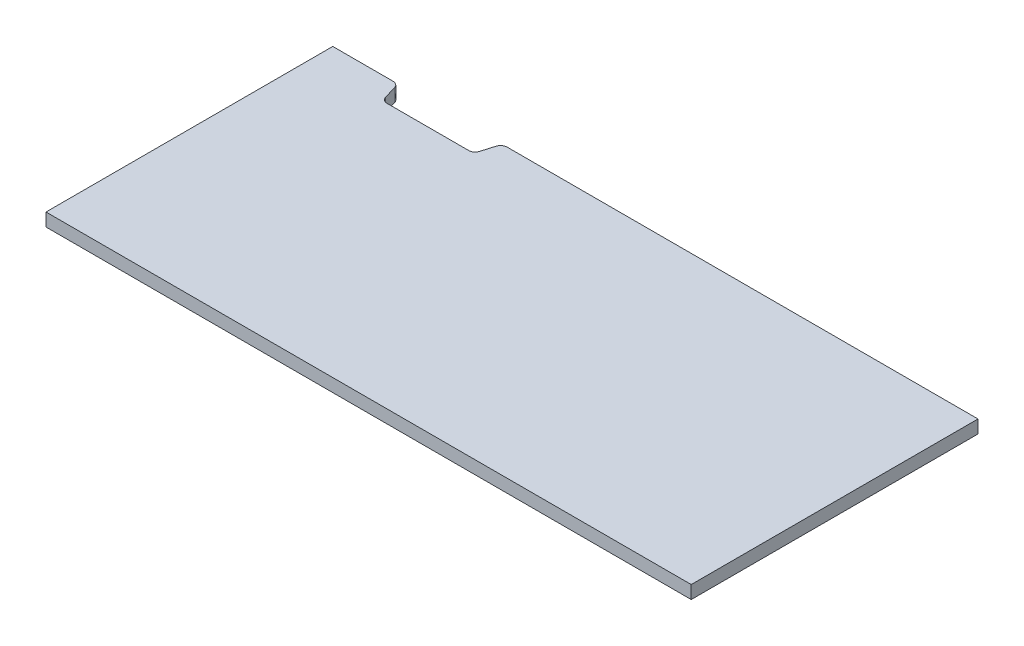
ISO-10303-21;
HEADER;
FILE_DESCRIPTION(('STEP AP214'),'2;1');
FILE_NAME('part.step','',(''),(''),'','','');
FILE_SCHEMA(('AUTOMOTIVE_DESIGN { 1 0 10303 214 1 1 1 1 }'));
ENDSEC;
DATA;
#1=APPLICATION_CONTEXT('core data for automotive mechanical design processes');
#2=APPLICATION_PROTOCOL_DEFINITION('international standard','automotive_design',2000,#1);
#3=PRODUCT_CONTEXT('',#1,'mechanical');
#4=PRODUCT('Part','Part','',(#3));
#5=PRODUCT_RELATED_PRODUCT_CATEGORY('part','',(#4));
#6=PRODUCT_DEFINITION_FORMATION('','',#4);
#7=PRODUCT_DEFINITION_CONTEXT('part definition',#1,'design');
#8=PRODUCT_DEFINITION('design','',#6,#7);
#9=PRODUCT_DEFINITION_SHAPE('','',#8);
#10=(LENGTH_UNIT() NAMED_UNIT(*) SI_UNIT(.MILLI.,.METRE.));
#11=(NAMED_UNIT(*) PLANE_ANGLE_UNIT() SI_UNIT($,.RADIAN.));
#12=(NAMED_UNIT(*) SI_UNIT($,.STERADIAN.) SOLID_ANGLE_UNIT());
#13=UNCERTAINTY_MEASURE_WITH_UNIT(LENGTH_MEASURE(1.E-05),#10,'distance_accuracy_value','');
#14=(GEOMETRIC_REPRESENTATION_CONTEXT(3) GLOBAL_UNCERTAINTY_ASSIGNED_CONTEXT((#13)) GLOBAL_UNIT_ASSIGNED_CONTEXT((#10,
#11,#12)) REPRESENTATION_CONTEXT('',''));
#15=CARTESIAN_POINT('',(0.,0.,0.));
#16=DIRECTION('',(0.,0.,1.));
#17=DIRECTION('',(1.,0.,0.));
#18=AXIS2_PLACEMENT_3D('',#15,#16,#17);
#19=CARTESIAN_POINT('',(-314.325,12.7,-139.7));
#20=DIRECTION('',(0.,0.,1.));
#21=DIRECTION('',(1.,0.,0.));
#22=AXIS2_PLACEMENT_3D('',#19,#20,#21);
#23=PLANE('',#22);
#24=DIRECTION('',(-1.,0.,0.));
#25=VECTOR('',#24,1.);
#26=CARTESIAN_POINT('',(-314.325,0.,-139.7));
#27=LINE('',#26,#25);
#28=CARTESIAN_POINT('',(314.325,0.,-139.7));
#29=VERTEX_POINT('',#28);
#30=CARTESIAN_POINT('',(-144.473689018744,0.,-139.7));
#31=VERTEX_POINT('',#30);
#32=EDGE_CURVE('E219',#29,#31,#27,.T.);
#33=ORIENTED_EDGE('',*,*,#32,.T.);
#34=DIRECTION('',(0.,-1.,0.));
#35=VECTOR('',#34,1.);
#36=CARTESIAN_POINT('',(-144.473689018744,12.7,-139.7));
#37=LINE('',#36,#35);
#38=CARTESIAN_POINT('',(-144.473689018744,12.7,-139.7));
#39=VERTEX_POINT('',#38);
#40=EDGE_CURVE('E129',#31,#39,#37,.F.);
#41=ORIENTED_EDGE('',*,*,#40,.T.);
#42=DIRECTION('',(-1.,0.,0.));
#43=VECTOR('',#42,1.);
#44=CARTESIAN_POINT('',(-314.325,12.7,-139.7));
#45=LINE('',#44,#43);
#46=CARTESIAN_POINT('',(314.325,12.7,-139.7));
#47=VERTEX_POINT('',#46);
#48=EDGE_CURVE('E122',#47,#39,#45,.T.);
#49=ORIENTED_EDGE('',*,*,#48,.F.);
#50=DIRECTION('',(0.,-1.,0.));
#51=VECTOR('',#50,1.);
#52=CARTESIAN_POINT('',(314.325,12.7,-139.7));
#53=LINE('',#52,#51);
#54=EDGE_CURVE('E126',#47,#29,#53,.T.);
#55=ORIENTED_EDGE('',*,*,#54,.T.);
#56=EDGE_LOOP('',(#33,#41,#49,#55));
#57=FACE_BOUND('',#56,.T.);
#58=ADVANCED_FACE('F33',(#57),#23,.F.);
#59=CARTESIAN_POINT('',(314.325,12.7,139.7));
#60=DIRECTION('',(-1.,0.,0.));
#61=DIRECTION('',(0.,0.,1.));
#62=AXIS2_PLACEMENT_3D('',#59,#60,#61);
#63=PLANE('',#62);
#64=DIRECTION('',(0.,0.,-1.));
#65=VECTOR('',#64,1.);
#66=CARTESIAN_POINT('',(314.325,0.,139.7));
#67=LINE('',#66,#65);
#68=CARTESIAN_POINT('',(314.325,0.,139.7));
#69=VERTEX_POINT('',#68);
#70=EDGE_CURVE('E147',#69,#29,#67,.T.);
#71=ORIENTED_EDGE('',*,*,#70,.T.);
#72=ORIENTED_EDGE('',*,*,#54,.F.);
#73=DIRECTION('',(0.,0.,-1.));
#74=VECTOR('',#73,1.);
#75=CARTESIAN_POINT('',(314.325,12.7,139.7));
#76=LINE('',#75,#74);
#77=CARTESIAN_POINT('',(314.325,12.7,139.7));
#78=VERTEX_POINT('',#77);
#79=EDGE_CURVE('E135',#78,#47,#76,.T.);
#80=ORIENTED_EDGE('',*,*,#79,.F.);
#81=DIRECTION('',(0.,-1.,0.));
#82=VECTOR('',#81,1.);
#83=CARTESIAN_POINT('',(314.325,12.7,139.7));
#84=LINE('',#83,#82);
#85=EDGE_CURVE('E216',#78,#69,#84,.T.);
#86=ORIENTED_EDGE('',*,*,#85,.T.);
#87=EDGE_LOOP('',(#71,#72,#80,#86));
#88=FACE_BOUND('',#87,.T.);
#89=ADVANCED_FACE('F145',(#88),#63,.F.);
#90=CARTESIAN_POINT('',(-255.576310981256,12.7,-139.7));
#91=VERTEX_POINT('',#90);
#92=CARTESIAN_POINT('',(-314.325,12.7,-139.7));
#93=VERTEX_POINT('',#92);
#94=EDGE_CURVE('E132',#91,#93,#45,.T.);
#95=ORIENTED_EDGE('',*,*,#94,.F.);
#96=DIRECTION('',(0.,-1.,0.));
#97=VECTOR('',#96,1.);
#98=CARTESIAN_POINT('',(-255.576310981256,12.7,-139.7));
#99=LINE('',#98,#97);
#100=CARTESIAN_POINT('',(-255.576310981256,0.,-139.7));
#101=VERTEX_POINT('',#100);
#102=EDGE_CURVE('E148',#91,#101,#99,.T.);
#103=ORIENTED_EDGE('',*,*,#102,.T.);
#104=CARTESIAN_POINT('',(-314.325,0.,-139.7));
#105=VERTEX_POINT('',#104);
#106=EDGE_CURVE('E218',#101,#105,#27,.T.);
#107=ORIENTED_EDGE('',*,*,#106,.T.);
#108=DIRECTION('',(0.,-1.,0.));
#109=VECTOR('',#108,1.);
#110=CARTESIAN_POINT('',(-314.325,12.7,-139.7));
#111=LINE('',#110,#109);
#112=EDGE_CURVE('E149',#93,#105,#111,.T.);
#113=ORIENTED_EDGE('',*,*,#112,.F.);
#114=EDGE_LOOP('',(#95,#103,#107,#113));
#115=FACE_BOUND('',#114,.T.);
#116=ADVANCED_FACE('F240',(#115),#23,.F.);
#117=CARTESIAN_POINT('',(-314.325,12.7,139.7));
#118=DIRECTION('',(1.,0.,0.));
#119=DIRECTION('',(0.,0.,-1.));
#120=AXIS2_PLACEMENT_3D('',#117,#118,#119);
#121=PLANE('',#120);
#122=DIRECTION('',(0.,0.,1.));
#123=VECTOR('',#122,1.);
#124=CARTESIAN_POINT('',(-314.325,0.,139.7));
#125=LINE('',#124,#123);
#126=CARTESIAN_POINT('',(-314.325,0.,139.7));
#127=VERTEX_POINT('',#126);
#128=EDGE_CURVE('E221',#105,#127,#125,.T.);
#129=ORIENTED_EDGE('',*,*,#128,.T.);
#130=DIRECTION('',(0.,-1.,0.));
#131=VECTOR('',#130,1.);
#132=CARTESIAN_POINT('',(-314.325,12.7,139.7));
#133=LINE('',#132,#131);
#134=CARTESIAN_POINT('',(-314.325,12.7,139.7));
#135=VERTEX_POINT('',#134);
#136=EDGE_CURVE('E155',#135,#127,#133,.T.);
#137=ORIENTED_EDGE('',*,*,#136,.F.);
#138=DIRECTION('',(0.,0.,1.));
#139=VECTOR('',#138,1.);
#140=CARTESIAN_POINT('',(-314.325,12.7,139.7));
#141=LINE('',#140,#139);
#142=EDGE_CURVE('E131',#93,#135,#141,.T.);
#143=ORIENTED_EDGE('',*,*,#142,.F.);
#144=ORIENTED_EDGE('',*,*,#112,.T.);
#145=EDGE_LOOP('',(#129,#137,#143,#144));
#146=FACE_BOUND('',#145,.T.);
#147=ADVANCED_FACE('F248',(#146),#121,.F.);
#148=CARTESIAN_POINT('',(-314.325,12.7,139.7));
#149=DIRECTION('',(0.,0.,-1.));
#150=DIRECTION('',(-1.,0.,0.));
#151=AXIS2_PLACEMENT_3D('',#148,#149,#150);
#152=PLANE('',#151);
#153=DIRECTION('',(1.,0.,0.));
#154=VECTOR('',#153,1.);
#155=CARTESIAN_POINT('',(-314.325,0.,139.7));
#156=LINE('',#155,#154);
#157=EDGE_CURVE('E143',#127,#69,#156,.T.);
#158=ORIENTED_EDGE('',*,*,#157,.T.);
#159=ORIENTED_EDGE('',*,*,#85,.F.);
#160=DIRECTION('',(1.,0.,0.));
#161=VECTOR('',#160,1.);
#162=CARTESIAN_POINT('',(-314.325,12.7,139.7));
#163=LINE('',#162,#161);
#164=EDGE_CURVE('E139',#135,#78,#163,.T.);
#165=ORIENTED_EDGE('',*,*,#164,.F.);
#166=ORIENTED_EDGE('',*,*,#136,.T.);
#167=EDGE_LOOP('',(#158,#159,#165,#166));
#168=FACE_BOUND('',#167,.T.);
#169=ADVANCED_FACE('F228',(#168),#152,.F.);
#170=CARTESIAN_POINT('',(0.,12.7,0.));
#171=DIRECTION('',(0.,-1.,0.));
#172=DIRECTION('',(0.,0.,-1.));
#173=AXIS2_PLACEMENT_3D('',#170,#171,#172);
#174=PLANE('',#173);
#175=DIRECTION('',(-0.282166323991551,0.,-0.95936550157127));
#176=VECTOR('',#175,1.);
#177=CARTESIAN_POINT('',(-250.825,12.7,-139.7));
#178=LINE('',#177,#176);
#179=CARTESIAN_POINT('',(-245.815659953722,12.7,-122.668243842654));
#180=VERTEX_POINT('',#179);
#181=CARTESIAN_POINT('',(-249.484340046278,12.7,-135.141756157346));
#182=VERTEX_POINT('',#181);
#183=EDGE_CURVE('E204',#180,#182,#178,.T.);
#184=ORIENTED_EDGE('',*,*,#183,.T.);
#185=CARTESIAN_POINT('',(-255.576310981256,12.7,-133.35));
#186=DIRECTION('',(0.,-1.,0.));
#187=DIRECTION('',(0.,0.,-1.));
#188=AXIS2_PLACEMENT_3D('',#185,#186,#187);
#189=CIRCLE('',#188,6.35);
#190=EDGE_CURVE('E169',#182,#91,#189,.F.);
#191=ORIENTED_EDGE('',*,*,#190,.T.);
#192=ORIENTED_EDGE('',*,*,#94,.T.);
#193=ORIENTED_EDGE('',*,*,#142,.T.);
#194=ORIENTED_EDGE('',*,*,#164,.T.);
#195=ORIENTED_EDGE('',*,*,#79,.T.);
#196=ORIENTED_EDGE('',*,*,#48,.T.);
#197=CARTESIAN_POINT('',(-144.473689018744,12.7,-133.35));
#198=DIRECTION('',(0.,-1.,0.));
#199=DIRECTION('',(0.,0.,-1.));
#200=AXIS2_PLACEMENT_3D('',#197,#198,#199);
#201=CIRCLE('',#200,6.35);
#202=CARTESIAN_POINT('',(-150.565659953722,12.7,-135.141756157346));
#203=VERTEX_POINT('',#202);
#204=EDGE_CURVE('E167',#39,#203,#201,.F.);
#205=ORIENTED_EDGE('',*,*,#204,.T.);
#206=DIRECTION('',(-0.28216632399155,0.,0.959365501571271));
#207=VECTOR('',#206,1.);
#208=CARTESIAN_POINT('',(-155.575,12.7,-118.11));
#209=LINE('',#208,#207);
#210=CARTESIAN_POINT('',(-154.234340046278,12.7,-122.668243842654));
#211=VERTEX_POINT('',#210);
#212=EDGE_CURVE('E205',#203,#211,#209,.T.);
#213=ORIENTED_EDGE('',*,*,#212,.T.);
#214=CARTESIAN_POINT('',(-160.326310981256,12.7,-124.46));
#215=DIRECTION('',(0.,-1.,0.));
#216=DIRECTION('',(0.,0.,-1.));
#217=AXIS2_PLACEMENT_3D('',#214,#215,#216);
#218=CIRCLE('',#217,6.35);
#219=CARTESIAN_POINT('',(-160.326310981256,12.7,-118.11));
#220=VERTEX_POINT('',#219);
#221=EDGE_CURVE('E11',#211,#220,#218,.T.);
#222=ORIENTED_EDGE('',*,*,#221,.T.);
#223=DIRECTION('',(-1.,0.,0.));
#224=VECTOR('',#223,1.);
#225=CARTESIAN_POINT('',(-244.475,12.7,-118.11));
#226=LINE('',#225,#224);
#227=CARTESIAN_POINT('',(-239.723689018744,12.7,-118.11));
#228=VERTEX_POINT('',#227);
#229=EDGE_CURVE('E202',#220,#228,#226,.T.);
#230=ORIENTED_EDGE('',*,*,#229,.T.);
#231=CARTESIAN_POINT('',(-239.723689018744,12.7,-124.46));
#232=DIRECTION('',(0.,-1.,0.));
#233=DIRECTION('',(0.,0.,-1.));
#234=AXIS2_PLACEMENT_3D('',#231,#232,#233);
#235=CIRCLE('',#234,6.35);
#236=EDGE_CURVE('E183',#228,#180,#235,.T.);
#237=ORIENTED_EDGE('',*,*,#236,.T.);
#238=EDGE_LOOP('',(#184,#191,#192,#193,#194,#195,#196,#205,#213,#222,#230,#237));
#239=FACE_BOUND('',#238,.T.);
#240=ADVANCED_FACE('F137',(#239),#174,.F.);
#241=CARTESIAN_POINT('',(0.,0.,0.));
#242=DIRECTION('',(0.,-1.,0.));
#243=DIRECTION('',(0.,0.,-1.));
#244=AXIS2_PLACEMENT_3D('',#241,#242,#243);
#245=PLANE('',#244);
#246=ORIENTED_EDGE('',*,*,#106,.F.);
#247=CARTESIAN_POINT('',(-255.576310981256,0.,-133.35));
#248=DIRECTION('',(0.,-1.,0.));
#249=DIRECTION('',(0.,0.,-1.));
#250=AXIS2_PLACEMENT_3D('',#247,#248,#249);
#251=CIRCLE('',#250,6.35);
#252=CARTESIAN_POINT('',(-249.484340046278,0.,-135.141756157346));
#253=VERTEX_POINT('',#252);
#254=EDGE_CURVE('E160',#101,#253,#251,.T.);
#255=ORIENTED_EDGE('',*,*,#254,.T.);
#256=DIRECTION('',(-0.282166323991551,0.,-0.95936550157127));
#257=VECTOR('',#256,1.);
#258=CARTESIAN_POINT('',(-250.825,0.,-139.7));
#259=LINE('',#258,#257);
#260=CARTESIAN_POINT('',(-245.815659953722,0.,-122.668243842654));
#261=VERTEX_POINT('',#260);
#262=EDGE_CURVE('E208',#261,#253,#259,.T.);
#263=ORIENTED_EDGE('',*,*,#262,.F.);
#264=CARTESIAN_POINT('',(-239.723689018744,0.,-124.46));
#265=DIRECTION('',(0.,-1.,0.));
#266=DIRECTION('',(0.,0.,-1.));
#267=AXIS2_PLACEMENT_3D('',#264,#265,#266);
#268=CIRCLE('',#267,6.35);
#269=CARTESIAN_POINT('',(-239.723689018744,0.,-118.11));
#270=VERTEX_POINT('',#269);
#271=EDGE_CURVE('E181',#261,#270,#268,.F.);
#272=ORIENTED_EDGE('',*,*,#271,.T.);
#273=DIRECTION('',(-1.,0.,0.));
#274=VECTOR('',#273,1.);
#275=CARTESIAN_POINT('',(-244.475,0.,-118.11));
#276=LINE('',#275,#274);
#277=CARTESIAN_POINT('',(-160.326310981256,0.,-118.11));
#278=VERTEX_POINT('',#277);
#279=EDGE_CURVE('E191',#278,#270,#276,.T.);
#280=ORIENTED_EDGE('',*,*,#279,.F.);
#281=CARTESIAN_POINT('',(-160.326310981256,0.,-124.46));
#282=DIRECTION('',(0.,-1.,0.));
#283=DIRECTION('',(0.,0.,-1.));
#284=AXIS2_PLACEMENT_3D('',#281,#282,#283);
#285=CIRCLE('',#284,6.35);
#286=CARTESIAN_POINT('',(-154.234340046278,0.,-122.668243842654));
#287=VERTEX_POINT('',#286);
#288=EDGE_CURVE('E41',#278,#287,#285,.F.);
#289=ORIENTED_EDGE('',*,*,#288,.T.);
#290=DIRECTION('',(-0.28216632399155,0.,0.959365501571271));
#291=VECTOR('',#290,1.);
#292=CARTESIAN_POINT('',(-155.575,0.,-118.11));
#293=LINE('',#292,#291);
#294=CARTESIAN_POINT('',(-150.565659953722,0.,-135.141756157346));
#295=VERTEX_POINT('',#294);
#296=EDGE_CURVE('E190',#295,#287,#293,.T.);
#297=ORIENTED_EDGE('',*,*,#296,.F.);
#298=CARTESIAN_POINT('',(-144.473689018744,0.,-133.35));
#299=DIRECTION('',(0.,-1.,0.));
#300=DIRECTION('',(0.,0.,-1.));
#301=AXIS2_PLACEMENT_3D('',#298,#299,#300);
#302=CIRCLE('',#301,6.35);
#303=EDGE_CURVE('E152',#295,#31,#302,.T.);
#304=ORIENTED_EDGE('',*,*,#303,.T.);
#305=ORIENTED_EDGE('',*,*,#32,.F.);
#306=ORIENTED_EDGE('',*,*,#70,.F.);
#307=ORIENTED_EDGE('',*,*,#157,.F.);
#308=ORIENTED_EDGE('',*,*,#128,.F.);
#309=EDGE_LOOP('',(#246,#255,#263,#272,#280,#289,#297,#304,#305,#306,#307,#308));
#310=FACE_BOUND('',#309,.T.);
#311=ADVANCED_FACE('F189',(#310),#245,.T.);
#312=CARTESIAN_POINT('',(-155.575,12.7,-118.11));
#313=DIRECTION('',(0.959365501571271,0.,0.28216632399155));
#314=DIRECTION('',(0.28216632399155,0.,-0.959365501571271));
#315=AXIS2_PLACEMENT_3D('',#312,#313,#314);
#316=PLANE('',#315);
#317=ORIENTED_EDGE('',*,*,#296,.T.);
#318=DIRECTION('',(0.,-1.,0.));
#319=VECTOR('',#318,1.);
#320=CARTESIAN_POINT('',(-154.234340046278,12.7,-122.668243842654));
#321=LINE('',#320,#319);
#322=EDGE_CURVE('E178',#287,#211,#321,.F.);
#323=ORIENTED_EDGE('',*,*,#322,.T.);
#324=ORIENTED_EDGE('',*,*,#212,.F.);
#325=DIRECTION('',(0.,-1.,0.));
#326=VECTOR('',#325,1.);
#327=CARTESIAN_POINT('',(-150.565659953722,12.7,-135.141756157346));
#328=LINE('',#327,#326);
#329=EDGE_CURVE('E175',#203,#295,#328,.T.);
#330=ORIENTED_EDGE('',*,*,#329,.T.);
#331=EDGE_LOOP('',(#317,#323,#324,#330));
#332=FACE_BOUND('',#331,.T.);
#333=ADVANCED_FACE('F196',(#332),#316,.F.);
#334=CARTESIAN_POINT('',(-250.825,12.7,-139.7));
#335=DIRECTION('',(-0.95936550157127,0.,0.282166323991551));
#336=DIRECTION('',(0.282166323991551,0.,0.95936550157127));
#337=AXIS2_PLACEMENT_3D('',#334,#335,#336);
#338=PLANE('',#337);
#339=ORIENTED_EDGE('',*,*,#262,.T.);
#340=DIRECTION('',(0.,-1.,0.));
#341=VECTOR('',#340,1.);
#342=CARTESIAN_POINT('',(-249.484340046278,12.7,-135.141756157346));
#343=LINE('',#342,#341);
#344=EDGE_CURVE('E165',#253,#182,#343,.F.);
#345=ORIENTED_EDGE('',*,*,#344,.T.);
#346=ORIENTED_EDGE('',*,*,#183,.F.);
#347=DIRECTION('',(0.,-1.,0.));
#348=VECTOR('',#347,1.);
#349=CARTESIAN_POINT('',(-245.815659953722,0.,-122.668243842654));
#350=LINE('',#349,#348);
#351=EDGE_CURVE('E162',#180,#261,#350,.T.);
#352=ORIENTED_EDGE('',*,*,#351,.T.);
#353=EDGE_LOOP('',(#339,#345,#346,#352));
#354=FACE_BOUND('',#353,.T.);
#355=ADVANCED_FACE('F263',(#354),#338,.F.);
#356=CARTESIAN_POINT('',(-244.475,12.7,-118.11));
#357=DIRECTION('',(0.,0.,1.));
#358=DIRECTION('',(1.,0.,0.));
#359=AXIS2_PLACEMENT_3D('',#356,#357,#358);
#360=PLANE('',#359);
#361=ORIENTED_EDGE('',*,*,#279,.T.);
#362=DIRECTION('',(0.,-1.,0.));
#363=VECTOR('',#362,1.);
#364=CARTESIAN_POINT('',(-239.723689018744,12.7,-118.11));
#365=LINE('',#364,#363);
#366=EDGE_CURVE('E48',#270,#228,#365,.F.);
#367=ORIENTED_EDGE('',*,*,#366,.T.);
#368=ORIENTED_EDGE('',*,*,#229,.F.);
#369=DIRECTION('',(0.,-1.,0.));
#370=VECTOR('',#369,1.);
#371=CARTESIAN_POINT('',(-160.326310981256,0.,-118.11));
#372=LINE('',#371,#370);
#373=EDGE_CURVE('E171',#220,#278,#372,.T.);
#374=ORIENTED_EDGE('',*,*,#373,.T.);
#375=EDGE_LOOP('',(#361,#367,#368,#374));
#376=FACE_BOUND('',#375,.T.);
#377=ADVANCED_FACE('F201',(#376),#360,.F.);
#378=CARTESIAN_POINT('',(-255.576310981256,12.7,-133.35));
#379=DIRECTION('',(0.,-1.,0.));
#380=DIRECTION('',(0.,0.,-1.));
#381=AXIS2_PLACEMENT_3D('',#378,#379,#380);
#382=CYLINDRICAL_SURFACE('',#381,6.35);
#383=ORIENTED_EDGE('',*,*,#190,.F.);
#384=ORIENTED_EDGE('',*,*,#344,.F.);
#385=ORIENTED_EDGE('',*,*,#254,.F.);
#386=ORIENTED_EDGE('',*,*,#102,.F.);
#387=EDGE_LOOP('',(#383,#384,#385,#386));
#388=FACE_BOUND('',#387,.T.);
#389=ADVANCED_FACE('F259',(#388),#382,.T.);
#390=CARTESIAN_POINT('',(-239.723689018744,12.7,-124.46));
#391=DIRECTION('',(0.,1.,0.));
#392=DIRECTION('',(0.,0.,1.));
#393=AXIS2_PLACEMENT_3D('',#390,#391,#392);
#394=CYLINDRICAL_SURFACE('',#393,6.35);
#395=ORIENTED_EDGE('',*,*,#236,.F.);
#396=ORIENTED_EDGE('',*,*,#366,.F.);
#397=ORIENTED_EDGE('',*,*,#271,.F.);
#398=ORIENTED_EDGE('',*,*,#351,.F.);
#399=EDGE_LOOP('',(#395,#396,#397,#398));
#400=FACE_BOUND('',#399,.T.);
#401=ADVANCED_FACE('F237',(#400),#394,.F.);
#402=CARTESIAN_POINT('',(-160.326310981256,12.7,-124.46));
#403=DIRECTION('',(0.,1.,0.));
#404=DIRECTION('',(0.,0.,1.));
#405=AXIS2_PLACEMENT_3D('',#402,#403,#404);
#406=CYLINDRICAL_SURFACE('',#405,6.35);
#407=ORIENTED_EDGE('',*,*,#221,.F.);
#408=ORIENTED_EDGE('',*,*,#322,.F.);
#409=ORIENTED_EDGE('',*,*,#288,.F.);
#410=ORIENTED_EDGE('',*,*,#373,.F.);
#411=EDGE_LOOP('',(#407,#408,#409,#410));
#412=FACE_BOUND('',#411,.T.);
#413=ADVANCED_FACE('F200',(#412),#406,.F.);
#414=CARTESIAN_POINT('',(-144.473689018744,12.7,-133.35));
#415=DIRECTION('',(0.,-1.,0.));
#416=DIRECTION('',(0.,0.,-1.));
#417=AXIS2_PLACEMENT_3D('',#414,#415,#416);
#418=CYLINDRICAL_SURFACE('',#417,6.35);
#419=ORIENTED_EDGE('',*,*,#204,.F.);
#420=ORIENTED_EDGE('',*,*,#40,.F.);
#421=ORIENTED_EDGE('',*,*,#303,.F.);
#422=ORIENTED_EDGE('',*,*,#329,.F.);
#423=EDGE_LOOP('',(#419,#420,#421,#422));
#424=FACE_BOUND('',#423,.T.);
#425=ADVANCED_FACE('F35',(#424),#418,.T.);
#426=CLOSED_SHELL('',(#58,#89,#116,#147,#169,#240,#311,#333,#355,#377,#389,#401,#413,#425));
#427=MANIFOLD_SOLID_BREP('B2',#426);
#428=ADVANCED_BREP_SHAPE_REPRESENTATION('',(#18,#427),#14);
#429=SHAPE_DEFINITION_REPRESENTATION(#9,#428);
ENDSEC;
END-ISO-10303-21;
